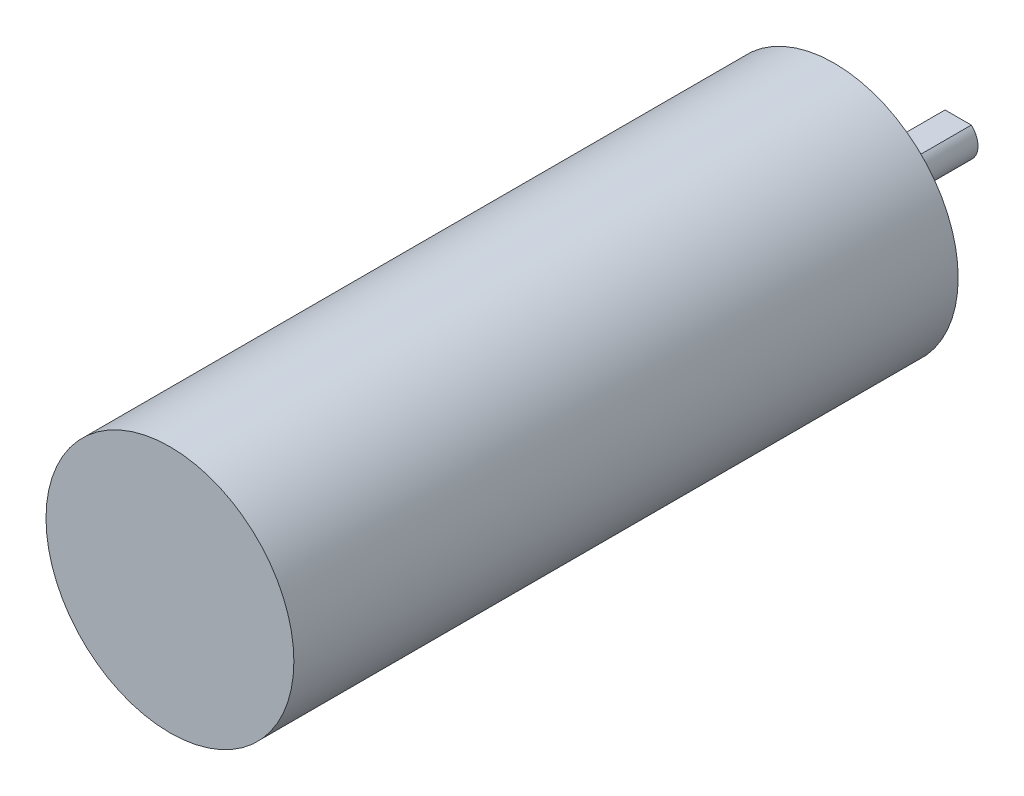
ISO-10303-21;
HEADER;
FILE_DESCRIPTION(('STEP AP214'),'2;1');
FILE_NAME('part.step','',(''),(''),'','','');
FILE_SCHEMA(('AUTOMOTIVE_DESIGN { 1 0 10303 214 1 1 1 1 }'));
ENDSEC;
DATA;
#1=APPLICATION_CONTEXT('core data for automotive mechanical design processes');
#2=APPLICATION_PROTOCOL_DEFINITION('international standard','automotive_design',2000,#1);
#3=PRODUCT_CONTEXT('',#1,'mechanical');
#4=PRODUCT('Part','Part','',(#3));
#5=PRODUCT_RELATED_PRODUCT_CATEGORY('part','',(#4));
#6=PRODUCT_DEFINITION_FORMATION('','',#4);
#7=PRODUCT_DEFINITION_CONTEXT('part definition',#1,'design');
#8=PRODUCT_DEFINITION('design','',#6,#7);
#9=PRODUCT_DEFINITION_SHAPE('','',#8);
#10=(LENGTH_UNIT() NAMED_UNIT(*) SI_UNIT(.MILLI.,.METRE.));
#11=(NAMED_UNIT(*) PLANE_ANGLE_UNIT() SI_UNIT($,.RADIAN.));
#12=(NAMED_UNIT(*) SI_UNIT($,.STERADIAN.) SOLID_ANGLE_UNIT());
#13=UNCERTAINTY_MEASURE_WITH_UNIT(LENGTH_MEASURE(1.E-05),#10,'distance_accuracy_value','');
#14=(GEOMETRIC_REPRESENTATION_CONTEXT(3) GLOBAL_UNCERTAINTY_ASSIGNED_CONTEXT((#13)) GLOBAL_UNIT_ASSIGNED_CONTEXT((#10,
#11,#12)) REPRESENTATION_CONTEXT('',''));
#15=CARTESIAN_POINT('',(0.,0.,0.));
#16=DIRECTION('',(0.,0.,1.));
#17=DIRECTION('',(1.,0.,0.));
#18=AXIS2_PLACEMENT_3D('',#15,#16,#17);
#19=CARTESIAN_POINT('',(0.,0.,67.));
#20=DIRECTION('',(0.,0.,-1.));
#21=DIRECTION('',(-1.,0.,0.));
#22=AXIS2_PLACEMENT_3D('',#19,#20,#21);
#23=CYLINDRICAL_SURFACE('',#22,12.5);
#24=CARTESIAN_POINT('',(0.,0.,67.));
#25=DIRECTION('',(0.,0.,1.));
#26=DIRECTION('',(1.,0.,0.));
#27=AXIS2_PLACEMENT_3D('',#24,#25,#26);
#28=CIRCLE('',#27,12.5);
#29=CARTESIAN_POINT('',(12.5,0.,67.));
#30=VERTEX_POINT('',#29);
#31=EDGE_CURVE('E48',#30,#30,#28,.T.);
#32=ORIENTED_EDGE('',*,*,#31,.F.);
#33=EDGE_LOOP('',(#32));
#34=FACE_BOUND('',#33,.T.);
#35=CARTESIAN_POINT('',(0.,0.,0.));
#36=DIRECTION('',(0.,0.,1.));
#37=DIRECTION('',(1.,0.,0.));
#38=AXIS2_PLACEMENT_3D('',#35,#36,#37);
#39=CIRCLE('',#38,12.5);
#40=CARTESIAN_POINT('',(12.5,0.,0.));
#41=VERTEX_POINT('',#40);
#42=EDGE_CURVE('E42',#41,#41,#39,.T.);
#43=ORIENTED_EDGE('',*,*,#42,.T.);
#44=EDGE_LOOP('',(#43));
#45=FACE_BOUND('',#44,.T.);
#46=ADVANCED_FACE('F39',(#34,#45),#23,.T.);
#47=CARTESIAN_POINT('',(0.,0.,67.));
#48=DIRECTION('',(0.,0.,1.));
#49=DIRECTION('',(1.,0.,0.));
#50=AXIS2_PLACEMENT_3D('',#47,#48,#49);
#51=PLANE('',#50);
#52=ORIENTED_EDGE('',*,*,#31,.T.);
#53=EDGE_LOOP('',(#52));
#54=FACE_BOUND('',#53,.T.);
#55=ADVANCED_FACE('F108',(#54),#51,.T.);
#56=CARTESIAN_POINT('',(0.,0.,0.));
#57=DIRECTION('',(0.,0.,1.));
#58=DIRECTION('',(1.,0.,0.));
#59=AXIS2_PLACEMENT_3D('',#56,#57,#58);
#60=PLANE('',#59);
#61=CARTESIAN_POINT('',(0.,-8.5,0.));
#62=DIRECTION('',(0.,0.,1.));
#63=DIRECTION('',(-1.,0.,0.));
#64=AXIS2_PLACEMENT_3D('',#61,#62,#63);
#65=CIRCLE('',#64,1.5);
#66=CARTESIAN_POINT('',(-1.5,-8.5,0.));
#67=VERTEX_POINT('',#66);
#68=EDGE_CURVE('E219',#67,#67,#65,.T.);
#69=ORIENTED_EDGE('',*,*,#68,.T.);
#70=EDGE_LOOP('',(#69));
#71=FACE_BOUND('',#70,.T.);
#72=CARTESIAN_POINT('',(0.,8.5,0.));
#73=DIRECTION('',(0.,0.,-1.));
#74=DIRECTION('',(-1.,0.,0.));
#75=AXIS2_PLACEMENT_3D('',#72,#73,#74);
#76=CIRCLE('',#75,1.5);
#77=CARTESIAN_POINT('',(-1.5,8.5,0.));
#78=VERTEX_POINT('',#77);
#79=EDGE_CURVE('E218',#78,#78,#76,.T.);
#80=ORIENTED_EDGE('',*,*,#79,.F.);
#81=EDGE_LOOP('',(#80));
#82=FACE_BOUND('',#81,.T.);
#83=CARTESIAN_POINT('',(0.,0.,0.));
#84=DIRECTION('',(0.,0.,-1.));
#85=DIRECTION('',(-1.,0.,0.));
#86=AXIS2_PLACEMENT_3D('',#83,#84,#85);
#87=CIRCLE('',#86,3.5);
#88=CARTESIAN_POINT('',(-3.5,0.,0.));
#89=VERTEX_POINT('',#88);
#90=EDGE_CURVE('E11',#89,#89,#87,.T.);
#91=ORIENTED_EDGE('',*,*,#90,.F.);
#92=EDGE_LOOP('',(#91));
#93=FACE_BOUND('',#92,.T.);
#94=ORIENTED_EDGE('',*,*,#42,.F.);
#95=EDGE_LOOP('',(#94));
#96=FACE_BOUND('',#95,.T.);
#97=ADVANCED_FACE('F105',(#71,#82,#93,#96),#60,.F.);
#98=CARTESIAN_POINT('',(0.,0.,-2.5));
#99=DIRECTION('',(0.,0.,1.));
#100=DIRECTION('',(1.,0.,0.));
#101=AXIS2_PLACEMENT_3D('',#98,#99,#100);
#102=CYLINDRICAL_SURFACE('',#101,3.5);
#103=CARTESIAN_POINT('',(0.,0.,-2.5));
#104=DIRECTION('',(0.,0.,-1.));
#105=DIRECTION('',(-1.,0.,0.));
#106=AXIS2_PLACEMENT_3D('',#103,#104,#105);
#107=CIRCLE('',#106,3.5);
#108=CARTESIAN_POINT('',(-3.5,0.,-2.5));
#109=VERTEX_POINT('',#108);
#110=EDGE_CURVE('E90',#109,#109,#107,.T.);
#111=ORIENTED_EDGE('',*,*,#110,.F.);
#112=EDGE_LOOP('',(#111));
#113=FACE_BOUND('',#112,.T.);
#114=ORIENTED_EDGE('',*,*,#90,.T.);
#115=EDGE_LOOP('',(#114));
#116=FACE_BOUND('',#115,.T.);
#117=ADVANCED_FACE('F107',(#113,#116),#102,.T.);
#118=CARTESIAN_POINT('',(0.,0.,-2.5));
#119=DIRECTION('',(0.,0.,-1.));
#120=DIRECTION('',(-1.,0.,0.));
#121=AXIS2_PLACEMENT_3D('',#118,#119,#120);
#122=PLANE('',#121);
#123=CARTESIAN_POINT('',(0.,0.,-2.5));
#124=DIRECTION('',(0.,0.,-1.));
#125=DIRECTION('',(-1.,0.,0.));
#126=AXIS2_PLACEMENT_3D('',#123,#124,#125);
#127=CIRCLE('',#126,2.);
#128=CARTESIAN_POINT('',(1.3228756555323,1.5,-2.5));
#129=VERTEX_POINT('',#128);
#130=CARTESIAN_POINT('',(-1.3228756555323,1.5,-2.5));
#131=VERTEX_POINT('',#130);
#132=EDGE_CURVE('E68',#129,#131,#127,.T.);
#133=ORIENTED_EDGE('',*,*,#132,.F.);
#134=DIRECTION('',(1.,0.,0.));
#135=VECTOR('',#134,1.);
#136=CARTESIAN_POINT('',(1.3228756555323,1.5,-2.5));
#137=LINE('',#136,#135);
#138=EDGE_CURVE('E55',#131,#129,#137,.T.);
#139=ORIENTED_EDGE('',*,*,#138,.F.);
#140=EDGE_LOOP('',(#133,#139));
#141=FACE_BOUND('',#140,.T.);
#142=ORIENTED_EDGE('',*,*,#110,.T.);
#143=EDGE_LOOP('',(#142));
#144=FACE_BOUND('',#143,.T.);
#145=ADVANCED_FACE('F69',(#141,#144),#122,.T.);
#146=CARTESIAN_POINT('',(0.,0.,-12.5));
#147=DIRECTION('',(0.,0.,1.));
#148=DIRECTION('',(1.,0.,0.));
#149=AXIS2_PLACEMENT_3D('',#146,#147,#148);
#150=CYLINDRICAL_SURFACE('',#149,2.);
#151=ORIENTED_EDGE('',*,*,#132,.T.);
#152=DIRECTION('',(0.,0.,1.));
#153=VECTOR('',#152,1.);
#154=CARTESIAN_POINT('',(-1.3228756555323,1.5,-12.5));
#155=LINE('',#154,#153);
#156=CARTESIAN_POINT('',(-1.3228756555323,1.5,-12.5));
#157=VERTEX_POINT('',#156);
#158=EDGE_CURVE('E81',#157,#131,#155,.T.);
#159=ORIENTED_EDGE('',*,*,#158,.F.);
#160=CARTESIAN_POINT('',(0.,0.,-12.5));
#161=DIRECTION('',(0.,0.,-1.));
#162=DIRECTION('',(-1.,0.,0.));
#163=AXIS2_PLACEMENT_3D('',#160,#161,#162);
#164=CIRCLE('',#163,2.);
#165=CARTESIAN_POINT('',(1.3228756555323,1.5,-12.5));
#166=VERTEX_POINT('',#165);
#167=EDGE_CURVE('E83',#166,#157,#164,.T.);
#168=ORIENTED_EDGE('',*,*,#167,.F.);
#169=DIRECTION('',(0.,0.,1.));
#170=VECTOR('',#169,1.);
#171=CARTESIAN_POINT('',(1.3228756555323,1.5,-12.5));
#172=LINE('',#171,#170);
#173=EDGE_CURVE('E79',#166,#129,#172,.T.);
#174=ORIENTED_EDGE('',*,*,#173,.T.);
#175=EDGE_LOOP('',(#151,#159,#168,#174));
#176=FACE_BOUND('',#175,.T.);
#177=ADVANCED_FACE('F85',(#176),#150,.T.);
#178=CARTESIAN_POINT('',(1.3228756555323,1.5,-12.5));
#179=DIRECTION('',(0.,-1.,0.));
#180=DIRECTION('',(0.,0.,-1.));
#181=AXIS2_PLACEMENT_3D('',#178,#179,#180);
#182=PLANE('',#181);
#183=ORIENTED_EDGE('',*,*,#138,.T.);
#184=ORIENTED_EDGE('',*,*,#173,.F.);
#185=DIRECTION('',(1.,0.,0.));
#186=VECTOR('',#185,1.);
#187=CARTESIAN_POINT('',(1.3228756555323,1.5,-12.5));
#188=LINE('',#187,#186);
#189=EDGE_CURVE('E63',#157,#166,#188,.T.);
#190=ORIENTED_EDGE('',*,*,#189,.F.);
#191=ORIENTED_EDGE('',*,*,#158,.T.);
#192=EDGE_LOOP('',(#183,#184,#190,#191));
#193=FACE_BOUND('',#192,.T.);
#194=ADVANCED_FACE('F78',(#193),#182,.F.);
#195=CARTESIAN_POINT('',(0.,0.,-12.5));
#196=DIRECTION('',(0.,0.,-1.));
#197=DIRECTION('',(-1.,0.,0.));
#198=AXIS2_PLACEMENT_3D('',#195,#196,#197);
#199=PLANE('',#198);
#200=ORIENTED_EDGE('',*,*,#167,.T.);
#201=ORIENTED_EDGE('',*,*,#189,.T.);
#202=EDGE_LOOP('',(#200,#201));
#203=FACE_BOUND('',#202,.T.);
#204=ADVANCED_FACE('F159',(#203),#199,.T.);
#205=CARTESIAN_POINT('',(0.,8.5,12.7));
#206=DIRECTION('',(0.,0.,-1.));
#207=DIRECTION('',(-1.,0.,0.));
#208=AXIS2_PLACEMENT_3D('',#205,#206,#207);
#209=CYLINDRICAL_SURFACE('',#208,1.5);
#210=CARTESIAN_POINT('',(0.,8.5,12.7));
#211=DIRECTION('',(0.,0.,-1.));
#212=DIRECTION('',(-1.,0.,0.));
#213=AXIS2_PLACEMENT_3D('',#210,#211,#212);
#214=CIRCLE('',#213,1.5);
#215=CARTESIAN_POINT('',(-1.5,8.5,12.7));
#216=VERTEX_POINT('',#215);
#217=EDGE_CURVE('E75',#216,#216,#214,.T.);
#218=ORIENTED_EDGE('',*,*,#217,.F.);
#219=EDGE_LOOP('',(#218));
#220=FACE_BOUND('',#219,.T.);
#221=ORIENTED_EDGE('',*,*,#79,.T.);
#222=EDGE_LOOP('',(#221));
#223=FACE_BOUND('',#222,.T.);
#224=ADVANCED_FACE('F168',(#220,#223),#209,.F.);
#225=CARTESIAN_POINT('',(0.,8.5,12.7));
#226=DIRECTION('',(0.,0.,-1.));
#227=DIRECTION('',(-1.,0.,0.));
#228=AXIS2_PLACEMENT_3D('',#225,#226,#227);
#229=PLANE('',#228);
#230=ORIENTED_EDGE('',*,*,#217,.T.);
#231=EDGE_LOOP('',(#230));
#232=FACE_BOUND('',#231,.T.);
#233=ADVANCED_FACE('F177',(#232),#229,.T.);
#234=CARTESIAN_POINT('',(0.,-8.5,12.7));
#235=DIRECTION('',(0.,0.,-1.));
#236=DIRECTION('',(-1.,0.,0.));
#237=AXIS2_PLACEMENT_3D('',#234,#235,#236);
#238=CYLINDRICAL_SURFACE('',#237,1.5);
#239=CARTESIAN_POINT('',(0.,-8.5,12.7));
#240=DIRECTION('',(0.,0.,1.));
#241=DIRECTION('',(-1.,0.,0.));
#242=AXIS2_PLACEMENT_3D('',#239,#240,#241);
#243=CIRCLE('',#242,1.5);
#244=CARTESIAN_POINT('',(-1.5,-8.5,12.7));
#245=VERTEX_POINT('',#244);
#246=EDGE_CURVE('E216',#245,#245,#243,.T.);
#247=ORIENTED_EDGE('',*,*,#246,.T.);
#248=EDGE_LOOP('',(#247));
#249=FACE_BOUND('',#248,.T.);
#250=ORIENTED_EDGE('',*,*,#68,.F.);
#251=EDGE_LOOP('',(#250));
#252=FACE_BOUND('',#251,.T.);
#253=ADVANCED_FACE('F186',(#249,#252),#238,.F.);
#254=CARTESIAN_POINT('',(0.,-8.5,12.7));
#255=DIRECTION('',(0.,0.,-1.));
#256=DIRECTION('',(-1.,0.,0.));
#257=AXIS2_PLACEMENT_3D('',#254,#255,#256);
#258=PLANE('',#257);
#259=ORIENTED_EDGE('',*,*,#246,.F.);
#260=EDGE_LOOP('',(#259));
#261=FACE_BOUND('',#260,.T.);
#262=ADVANCED_FACE('F200',(#261),#258,.T.);
#263=CLOSED_SHELL('',(#46,#55,#97,#117,#145,#177,#194,#204,#224,#233,#253,#262));
#264=MANIFOLD_SOLID_BREP('B2',#263);
#265=ADVANCED_BREP_SHAPE_REPRESENTATION('',(#18,#264),#14);
#266=SHAPE_DEFINITION_REPRESENTATION(#9,#265);
ENDSEC;
END-ISO-10303-21;
